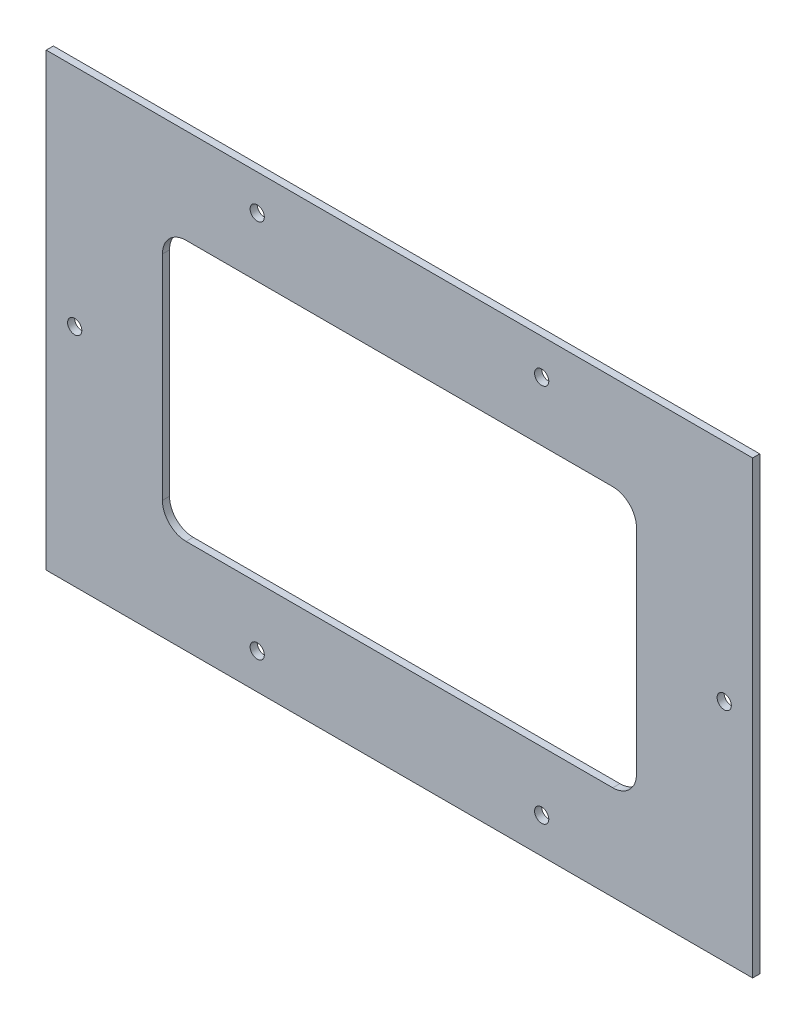
ISO-10303-21;
HEADER;
FILE_DESCRIPTION(('STEP AP214'),'2;1');
FILE_NAME('part.step','',(''),(''),'','','');
FILE_SCHEMA(('AUTOMOTIVE_DESIGN { 1 0 10303 214 1 1 1 1 }'));
ENDSEC;
DATA;
#1=APPLICATION_CONTEXT('core data for automotive mechanical design processes');
#2=APPLICATION_PROTOCOL_DEFINITION('international standard','automotive_design',2000,#1);
#3=PRODUCT_CONTEXT('',#1,'mechanical');
#4=PRODUCT('Part','Part','',(#3));
#5=PRODUCT_RELATED_PRODUCT_CATEGORY('part','',(#4));
#6=PRODUCT_DEFINITION_FORMATION('','',#4);
#7=PRODUCT_DEFINITION_CONTEXT('part definition',#1,'design');
#8=PRODUCT_DEFINITION('design','',#6,#7);
#9=PRODUCT_DEFINITION_SHAPE('','',#8);
#10=(LENGTH_UNIT() NAMED_UNIT(*) SI_UNIT(.MILLI.,.METRE.));
#11=(NAMED_UNIT(*) PLANE_ANGLE_UNIT() SI_UNIT($,.RADIAN.));
#12=(NAMED_UNIT(*) SI_UNIT($,.STERADIAN.) SOLID_ANGLE_UNIT());
#13=UNCERTAINTY_MEASURE_WITH_UNIT(LENGTH_MEASURE(1.E-05),#10,'distance_accuracy_value','');
#14=(GEOMETRIC_REPRESENTATION_CONTEXT(3) GLOBAL_UNCERTAINTY_ASSIGNED_CONTEXT((#13)) GLOBAL_UNIT_ASSIGNED_CONTEXT((#10,
#11,#12)) REPRESENTATION_CONTEXT('',''));
#15=CARTESIAN_POINT('',(0.,0.,0.));
#16=DIRECTION('',(0.,0.,1.));
#17=DIRECTION('',(1.,0.,0.));
#18=AXIS2_PLACEMENT_3D('',#15,#16,#17);
#19=CARTESIAN_POINT('',(0.,0.,1.5));
#20=DIRECTION('',(0.,0.,1.));
#21=DIRECTION('',(1.,0.,0.));
#22=AXIS2_PLACEMENT_3D('',#19,#20,#21);
#23=PLANE('',#22);
#24=DIRECTION('',(1.,0.,0.));
#25=VECTOR('',#24,1.);
#26=CARTESIAN_POINT('',(-74.5,155.,1.5));
#27=LINE('',#26,#25);
#28=CARTESIAN_POINT('',(-74.5,155.,1.5));
#29=VERTEX_POINT('',#28);
#30=CARTESIAN_POINT('',(74.5,155.,1.5));
#31=VERTEX_POINT('',#30);
#32=EDGE_CURVE('E48',#29,#31,#27,.T.);
#33=ORIENTED_EDGE('',*,*,#32,.F.);
#34=DIRECTION('',(0.,-1.,0.));
#35=VECTOR('',#34,1.);
#36=CARTESIAN_POINT('',(-74.5,165.,1.5));
#37=LINE('',#36,#35);
#38=CARTESIAN_POINT('',(-74.5,60.0000000000001,1.5));
#39=VERTEX_POINT('',#38);
#40=EDGE_CURVE('E136',#29,#39,#37,.T.);
#41=ORIENTED_EDGE('',*,*,#40,.T.);
#42=DIRECTION('',(-1.,0.,0.));
#43=VECTOR('',#42,1.);
#44=CARTESIAN_POINT('',(74.5,60.0000000000001,1.5));
#45=LINE('',#44,#43);
#46=CARTESIAN_POINT('',(74.5,60.0000000000001,1.5));
#47=VERTEX_POINT('',#46);
#48=EDGE_CURVE('E227',#47,#39,#45,.T.);
#49=ORIENTED_EDGE('',*,*,#48,.F.);
#50=DIRECTION('',(0.,1.,0.));
#51=VECTOR('',#50,1.);
#52=CARTESIAN_POINT('',(74.5,165.,1.5));
#53=LINE('',#52,#51);
#54=EDGE_CURVE('E148',#47,#31,#53,.T.);
#55=ORIENTED_EDGE('',*,*,#54,.T.);
#56=EDGE_LOOP('',(#33,#41,#49,#55));
#57=FACE_BOUND('',#56,.T.);
#58=CARTESIAN_POINT('',(68.5,107.5,1.5));
#59=DIRECTION('',(0.,0.,1.));
#60=DIRECTION('',(-1.,0.,0.));
#61=AXIS2_PLACEMENT_3D('',#58,#59,#60);
#62=CIRCLE('',#61,1.5);
#63=CARTESIAN_POINT('',(67.,107.5,1.5));
#64=VERTEX_POINT('',#63);
#65=EDGE_CURVE('E242',#64,#64,#62,.T.);
#66=ORIENTED_EDGE('',*,*,#65,.F.);
#67=EDGE_LOOP('',(#66));
#68=FACE_BOUND('',#67,.T.);
#69=CARTESIAN_POINT('',(-68.5,107.5,1.5));
#70=DIRECTION('',(0.,0.,1.));
#71=DIRECTION('',(1.,0.,0.));
#72=AXIS2_PLACEMENT_3D('',#69,#70,#71);
#73=CIRCLE('',#72,1.5);
#74=CARTESIAN_POINT('',(-67.,107.5,1.5));
#75=VERTEX_POINT('',#74);
#76=EDGE_CURVE('E241',#75,#75,#73,.T.);
#77=ORIENTED_EDGE('',*,*,#76,.F.);
#78=EDGE_LOOP('',(#77));
#79=FACE_BOUND('',#78,.T.);
#80=CARTESIAN_POINT('',(30.,147.5,1.5));
#81=DIRECTION('',(0.,0.,1.));
#82=DIRECTION('',(-1.,0.,0.));
#83=AXIS2_PLACEMENT_3D('',#80,#81,#82);
#84=CIRCLE('',#83,1.50000000000001);
#85=CARTESIAN_POINT('',(28.5,147.5,1.5));
#86=VERTEX_POINT('',#85);
#87=EDGE_CURVE('E231',#86,#86,#84,.T.);
#88=ORIENTED_EDGE('',*,*,#87,.F.);
#89=EDGE_LOOP('',(#88));
#90=FACE_BOUND('',#89,.T.);
#91=CARTESIAN_POINT('',(30.,67.5,1.5));
#92=DIRECTION('',(0.,0.,1.));
#93=DIRECTION('',(1.,0.,0.));
#94=AXIS2_PLACEMENT_3D('',#91,#92,#93);
#95=CIRCLE('',#94,1.50000000000001);
#96=CARTESIAN_POINT('',(31.5,67.5,1.5));
#97=VERTEX_POINT('',#96);
#98=EDGE_CURVE('E256',#97,#97,#95,.T.);
#99=ORIENTED_EDGE('',*,*,#98,.F.);
#100=EDGE_LOOP('',(#99));
#101=FACE_BOUND('',#100,.T.);
#102=CARTESIAN_POINT('',(-30.,67.5,1.5));
#103=DIRECTION('',(0.,0.,1.));
#104=DIRECTION('',(-1.,0.,0.));
#105=AXIS2_PLACEMENT_3D('',#102,#103,#104);
#106=CIRCLE('',#105,1.5);
#107=CARTESIAN_POINT('',(-31.5,67.5,1.5));
#108=VERTEX_POINT('',#107);
#109=EDGE_CURVE('E261',#108,#108,#106,.T.);
#110=ORIENTED_EDGE('',*,*,#109,.F.);
#111=EDGE_LOOP('',(#110));
#112=FACE_BOUND('',#111,.T.);
#113=CARTESIAN_POINT('',(-30.,147.5,1.5));
#114=DIRECTION('',(0.,0.,1.));
#115=DIRECTION('',(1.,0.,0.));
#116=AXIS2_PLACEMENT_3D('',#113,#114,#115);
#117=CIRCLE('',#116,1.5);
#118=CARTESIAN_POINT('',(-28.5,147.5,1.5));
#119=VERTEX_POINT('',#118);
#120=EDGE_CURVE('E214',#119,#119,#117,.T.);
#121=ORIENTED_EDGE('',*,*,#120,.F.);
#122=EDGE_LOOP('',(#121));
#123=FACE_BOUND('',#122,.T.);
#124=DIRECTION('',(1.,0.,0.));
#125=VECTOR('',#124,1.);
#126=CARTESIAN_POINT('',(-50.0000000000001,80.,1.5));
#127=LINE('',#126,#125);
#128=CARTESIAN_POINT('',(-45.0000000000001,80.,1.5));
#129=VERTEX_POINT('',#128);
#130=CARTESIAN_POINT('',(45.,80.,1.5));
#131=VERTEX_POINT('',#130);
#132=EDGE_CURVE('E205',#129,#131,#127,.T.);
#133=ORIENTED_EDGE('',*,*,#132,.F.);
#134=CARTESIAN_POINT('',(-45.0000000000001,85.,1.5));
#135=DIRECTION('',(0.,0.,1.));
#136=DIRECTION('',(1.,0.,0.));
#137=AXIS2_PLACEMENT_3D('',#134,#135,#136);
#138=CIRCLE('',#137,5.);
#139=CARTESIAN_POINT('',(-50.0000000000001,85.,1.5));
#140=VERTEX_POINT('',#139);
#141=EDGE_CURVE('E11',#129,#140,#138,.F.);
#142=ORIENTED_EDGE('',*,*,#141,.T.);
#143=DIRECTION('',(0.,-1.,0.));
#144=VECTOR('',#143,1.);
#145=CARTESIAN_POINT('',(-50.,135.,1.5));
#146=LINE('',#145,#144);
#147=CARTESIAN_POINT('',(-50.,130.,1.5));
#148=VERTEX_POINT('',#147);
#149=EDGE_CURVE('E203',#148,#140,#146,.T.);
#150=ORIENTED_EDGE('',*,*,#149,.F.);
#151=CARTESIAN_POINT('',(-45.,130.,1.5));
#152=DIRECTION('',(0.,0.,1.));
#153=DIRECTION('',(1.,0.,0.));
#154=AXIS2_PLACEMENT_3D('',#151,#152,#153);
#155=CIRCLE('',#154,5.);
#156=CARTESIAN_POINT('',(-45.,135.,1.5));
#157=VERTEX_POINT('',#156);
#158=EDGE_CURVE('E181',#148,#157,#155,.F.);
#159=ORIENTED_EDGE('',*,*,#158,.T.);
#160=DIRECTION('',(-1.,0.,0.));
#161=VECTOR('',#160,1.);
#162=CARTESIAN_POINT('',(-50.,135.,1.5));
#163=LINE('',#162,#161);
#164=CARTESIAN_POINT('',(45.,135.,1.5));
#165=VERTEX_POINT('',#164);
#166=EDGE_CURVE('E141',#165,#157,#163,.T.);
#167=ORIENTED_EDGE('',*,*,#166,.F.);
#168=CARTESIAN_POINT('',(45.,130.,1.5));
#169=DIRECTION('',(0.,0.,1.));
#170=DIRECTION('',(1.,0.,0.));
#171=AXIS2_PLACEMENT_3D('',#168,#169,#170);
#172=CIRCLE('',#171,5.);
#173=CARTESIAN_POINT('',(50.,130.,1.5));
#174=VERTEX_POINT('',#173);
#175=EDGE_CURVE('E177',#165,#174,#172,.F.);
#176=ORIENTED_EDGE('',*,*,#175,.T.);
#177=DIRECTION('',(0.,1.,0.));
#178=VECTOR('',#177,1.);
#179=CARTESIAN_POINT('',(50.,135.,1.5));
#180=LINE('',#179,#178);
#181=CARTESIAN_POINT('',(50.,85.,1.5));
#182=VERTEX_POINT('',#181);
#183=EDGE_CURVE('E145',#182,#174,#180,.T.);
#184=ORIENTED_EDGE('',*,*,#183,.F.);
#185=CARTESIAN_POINT('',(45.,85.,1.5));
#186=DIRECTION('',(0.,0.,1.));
#187=DIRECTION('',(1.,0.,0.));
#188=AXIS2_PLACEMENT_3D('',#185,#186,#187);
#189=CIRCLE('',#188,5.);
#190=EDGE_CURVE('E173',#182,#131,#189,.F.);
#191=ORIENTED_EDGE('',*,*,#190,.T.);
#192=EDGE_LOOP('',(#133,#142,#150,#159,#167,#176,#184,#191));
#193=FACE_BOUND('',#192,.T.);
#194=ADVANCED_FACE('F33',(#57,#68,#79,#90,#101,#112,#123,#193),#23,.T.);
#195=CARTESIAN_POINT('',(0.,0.,0.));
#196=DIRECTION('',(0.,0.,1.));
#197=DIRECTION('',(1.,0.,0.));
#198=AXIS2_PLACEMENT_3D('',#195,#196,#197);
#199=PLANE('',#198);
#200=CARTESIAN_POINT('',(68.5,107.5,0.));
#201=DIRECTION('',(0.,0.,1.));
#202=DIRECTION('',(-1.,0.,0.));
#203=AXIS2_PLACEMENT_3D('',#200,#201,#202);
#204=CIRCLE('',#203,1.5);
#205=CARTESIAN_POINT('',(67.,107.5,0.));
#206=VERTEX_POINT('',#205);
#207=EDGE_CURVE('E238',#206,#206,#204,.T.);
#208=ORIENTED_EDGE('',*,*,#207,.T.);
#209=EDGE_LOOP('',(#208));
#210=FACE_BOUND('',#209,.T.);
#211=CARTESIAN_POINT('',(-68.5,107.5,0.));
#212=DIRECTION('',(0.,0.,1.));
#213=DIRECTION('',(1.,0.,0.));
#214=AXIS2_PLACEMENT_3D('',#211,#212,#213);
#215=CIRCLE('',#214,1.5);
#216=CARTESIAN_POINT('',(-67.,107.5,0.));
#217=VERTEX_POINT('',#216);
#218=EDGE_CURVE('E247',#217,#217,#215,.T.);
#219=ORIENTED_EDGE('',*,*,#218,.T.);
#220=EDGE_LOOP('',(#219));
#221=FACE_BOUND('',#220,.T.);
#222=CARTESIAN_POINT('',(30.,147.5,0.));
#223=DIRECTION('',(0.,0.,1.));
#224=DIRECTION('',(-1.,0.,0.));
#225=AXIS2_PLACEMENT_3D('',#222,#223,#224);
#226=CIRCLE('',#225,1.50000000000001);
#227=CARTESIAN_POINT('',(28.5,147.5,0.));
#228=VERTEX_POINT('',#227);
#229=EDGE_CURVE('E234',#228,#228,#226,.T.);
#230=ORIENTED_EDGE('',*,*,#229,.T.);
#231=EDGE_LOOP('',(#230));
#232=FACE_BOUND('',#231,.T.);
#233=CARTESIAN_POINT('',(30.,67.5,0.));
#234=DIRECTION('',(0.,0.,1.));
#235=DIRECTION('',(1.,0.,0.));
#236=AXIS2_PLACEMENT_3D('',#233,#234,#235);
#237=CIRCLE('',#236,1.50000000000001);
#238=CARTESIAN_POINT('',(31.5,67.5,0.));
#239=VERTEX_POINT('',#238);
#240=EDGE_CURVE('E258',#239,#239,#237,.T.);
#241=ORIENTED_EDGE('',*,*,#240,.T.);
#242=EDGE_LOOP('',(#241));
#243=FACE_BOUND('',#242,.T.);
#244=CARTESIAN_POINT('',(-30.,67.5,0.));
#245=DIRECTION('',(0.,0.,1.));
#246=DIRECTION('',(-1.,0.,0.));
#247=AXIS2_PLACEMENT_3D('',#244,#245,#246);
#248=CIRCLE('',#247,1.5);
#249=CARTESIAN_POINT('',(-31.5,67.5,0.));
#250=VERTEX_POINT('',#249);
#251=EDGE_CURVE('E264',#250,#250,#248,.T.);
#252=ORIENTED_EDGE('',*,*,#251,.T.);
#253=EDGE_LOOP('',(#252));
#254=FACE_BOUND('',#253,.T.);
#255=CARTESIAN_POINT('',(-30.,147.5,0.));
#256=DIRECTION('',(0.,0.,1.));
#257=DIRECTION('',(1.,0.,0.));
#258=AXIS2_PLACEMENT_3D('',#255,#256,#257);
#259=CIRCLE('',#258,1.5);
#260=CARTESIAN_POINT('',(-28.5,147.5,0.));
#261=VERTEX_POINT('',#260);
#262=EDGE_CURVE('E219',#261,#261,#259,.T.);
#263=ORIENTED_EDGE('',*,*,#262,.T.);
#264=EDGE_LOOP('',(#263));
#265=FACE_BOUND('',#264,.T.);
#266=DIRECTION('',(0.,-1.,0.));
#267=VECTOR('',#266,1.);
#268=CARTESIAN_POINT('',(-74.5,165.,0.));
#269=LINE('',#268,#267);
#270=CARTESIAN_POINT('',(-74.5,155.,0.));
#271=VERTEX_POINT('',#270);
#272=CARTESIAN_POINT('',(-74.5,60.0000000000001,0.));
#273=VERTEX_POINT('',#272);
#274=EDGE_CURVE('E134',#271,#273,#269,.T.);
#275=ORIENTED_EDGE('',*,*,#274,.F.);
#276=DIRECTION('',(1.,0.,0.));
#277=VECTOR('',#276,1.);
#278=CARTESIAN_POINT('',(-74.5,155.,0.));
#279=LINE('',#278,#277);
#280=CARTESIAN_POINT('',(74.5,155.,0.));
#281=VERTEX_POINT('',#280);
#282=EDGE_CURVE('E119',#271,#281,#279,.T.);
#283=ORIENTED_EDGE('',*,*,#282,.T.);
#284=DIRECTION('',(0.,1.,0.));
#285=VECTOR('',#284,1.);
#286=CARTESIAN_POINT('',(74.5,165.,0.));
#287=LINE('',#286,#285);
#288=CARTESIAN_POINT('',(74.5,60.0000000000001,0.));
#289=VERTEX_POINT('',#288);
#290=EDGE_CURVE('E140',#289,#281,#287,.T.);
#291=ORIENTED_EDGE('',*,*,#290,.F.);
#292=DIRECTION('',(-1.,0.,0.));
#293=VECTOR('',#292,1.);
#294=CARTESIAN_POINT('',(74.5,60.0000000000001,0.));
#295=LINE('',#294,#293);
#296=EDGE_CURVE('E56',#289,#273,#295,.T.);
#297=ORIENTED_EDGE('',*,*,#296,.T.);
#298=EDGE_LOOP('',(#275,#283,#291,#297));
#299=FACE_BOUND('',#298,.T.);
#300=DIRECTION('',(-1.,0.,0.));
#301=VECTOR('',#300,1.);
#302=CARTESIAN_POINT('',(-50.,135.,0.));
#303=LINE('',#302,#301);
#304=CARTESIAN_POINT('',(45.,135.,0.));
#305=VERTEX_POINT('',#304);
#306=CARTESIAN_POINT('',(-45.,135.,0.));
#307=VERTEX_POINT('',#306);
#308=EDGE_CURVE('E209',#305,#307,#303,.T.);
#309=ORIENTED_EDGE('',*,*,#308,.T.);
#310=CARTESIAN_POINT('',(-45.,130.,0.));
#311=DIRECTION('',(0.,0.,1.));
#312=DIRECTION('',(1.,0.,0.));
#313=AXIS2_PLACEMENT_3D('',#310,#311,#312);
#314=CIRCLE('',#313,5.);
#315=CARTESIAN_POINT('',(-50.,130.,0.));
#316=VERTEX_POINT('',#315);
#317=EDGE_CURVE('E179',#307,#316,#314,.T.);
#318=ORIENTED_EDGE('',*,*,#317,.T.);
#319=DIRECTION('',(0.,-1.,0.));
#320=VECTOR('',#319,1.);
#321=CARTESIAN_POINT('',(-50.,135.,0.));
#322=LINE('',#321,#320);
#323=CARTESIAN_POINT('',(-50.0000000000001,85.,0.));
#324=VERTEX_POINT('',#323);
#325=EDGE_CURVE('E188',#316,#324,#322,.T.);
#326=ORIENTED_EDGE('',*,*,#325,.T.);
#327=CARTESIAN_POINT('',(-45.0000000000001,85.,0.));
#328=DIRECTION('',(0.,0.,1.));
#329=DIRECTION('',(1.,0.,0.));
#330=AXIS2_PLACEMENT_3D('',#327,#328,#329);
#331=CIRCLE('',#330,5.);
#332=CARTESIAN_POINT('',(-45.0000000000001,80.,0.));
#333=VERTEX_POINT('',#332);
#334=EDGE_CURVE('E41',#324,#333,#331,.T.);
#335=ORIENTED_EDGE('',*,*,#334,.T.);
#336=DIRECTION('',(1.,0.,0.));
#337=VECTOR('',#336,1.);
#338=CARTESIAN_POINT('',(-50.0000000000001,80.,0.));
#339=LINE('',#338,#337);
#340=CARTESIAN_POINT('',(45.,80.,0.));
#341=VERTEX_POINT('',#340);
#342=EDGE_CURVE('E186',#333,#341,#339,.T.);
#343=ORIENTED_EDGE('',*,*,#342,.T.);
#344=CARTESIAN_POINT('',(45.,85.,0.));
#345=DIRECTION('',(0.,0.,1.));
#346=DIRECTION('',(1.,0.,0.));
#347=AXIS2_PLACEMENT_3D('',#344,#345,#346);
#348=CIRCLE('',#347,5.);
#349=CARTESIAN_POINT('',(50.,85.,0.));
#350=VERTEX_POINT('',#349);
#351=EDGE_CURVE('E171',#341,#350,#348,.T.);
#352=ORIENTED_EDGE('',*,*,#351,.T.);
#353=DIRECTION('',(0.,1.,0.));
#354=VECTOR('',#353,1.);
#355=CARTESIAN_POINT('',(50.,135.,0.));
#356=LINE('',#355,#354);
#357=CARTESIAN_POINT('',(50.,130.,0.));
#358=VERTEX_POINT('',#357);
#359=EDGE_CURVE('E197',#350,#358,#356,.T.);
#360=ORIENTED_EDGE('',*,*,#359,.T.);
#361=CARTESIAN_POINT('',(45.,130.,0.));
#362=DIRECTION('',(0.,0.,1.));
#363=DIRECTION('',(1.,0.,0.));
#364=AXIS2_PLACEMENT_3D('',#361,#362,#363);
#365=CIRCLE('',#364,5.);
#366=EDGE_CURVE('E175',#358,#305,#365,.T.);
#367=ORIENTED_EDGE('',*,*,#366,.T.);
#368=EDGE_LOOP('',(#309,#318,#326,#335,#343,#352,#360,#367));
#369=FACE_BOUND('',#368,.T.);
#370=ADVANCED_FACE('F138',(#210,#221,#232,#243,#254,#265,#299,#369),#199,.F.);
#371=CARTESIAN_POINT('',(-74.5,165.,1.5));
#372=DIRECTION('',(1.,0.,0.));
#373=DIRECTION('',(0.,1.,0.));
#374=AXIS2_PLACEMENT_3D('',#371,#372,#373);
#375=PLANE('',#374);
#376=ORIENTED_EDGE('',*,*,#40,.F.);
#377=DIRECTION('',(0.,0.,1.));
#378=VECTOR('',#377,1.);
#379=CARTESIAN_POINT('',(-74.5,155.,0.));
#380=LINE('',#379,#378);
#381=EDGE_CURVE('E122',#271,#29,#380,.T.);
#382=ORIENTED_EDGE('',*,*,#381,.F.);
#383=ORIENTED_EDGE('',*,*,#274,.T.);
#384=DIRECTION('',(0.,0.,1.));
#385=VECTOR('',#384,1.);
#386=CARTESIAN_POINT('',(-74.5,60.0000000000001,0.));
#387=LINE('',#386,#385);
#388=EDGE_CURVE('E248',#273,#39,#387,.T.);
#389=ORIENTED_EDGE('',*,*,#388,.T.);
#390=EDGE_LOOP('',(#376,#382,#383,#389));
#391=FACE_BOUND('',#390,.T.);
#392=ADVANCED_FACE('F132',(#391),#375,.F.);
#393=CARTESIAN_POINT('',(74.5,165.,1.5));
#394=DIRECTION('',(-1.,0.,0.));
#395=DIRECTION('',(0.,-1.,0.));
#396=AXIS2_PLACEMENT_3D('',#393,#394,#395);
#397=PLANE('',#396);
#398=ORIENTED_EDGE('',*,*,#290,.T.);
#399=DIRECTION('',(0.,0.,1.));
#400=VECTOR('',#399,1.);
#401=CARTESIAN_POINT('',(74.5,155.,0.));
#402=LINE('',#401,#400);
#403=EDGE_CURVE('E123',#281,#31,#402,.T.);
#404=ORIENTED_EDGE('',*,*,#403,.T.);
#405=ORIENTED_EDGE('',*,*,#54,.F.);
#406=DIRECTION('',(0.,0.,1.));
#407=VECTOR('',#406,1.);
#408=CARTESIAN_POINT('',(74.5,60.0000000000001,0.));
#409=LINE('',#408,#407);
#410=EDGE_CURVE('E230',#289,#47,#409,.T.);
#411=ORIENTED_EDGE('',*,*,#410,.F.);
#412=EDGE_LOOP('',(#398,#404,#405,#411));
#413=FACE_BOUND('',#412,.T.);
#414=ADVANCED_FACE('F229',(#413),#397,.F.);
#415=CARTESIAN_POINT('',(-50.,135.,1.5));
#416=DIRECTION('',(1.,0.,0.));
#417=DIRECTION('',(0.,1.,0.));
#418=AXIS2_PLACEMENT_3D('',#415,#416,#417);
#419=PLANE('',#418);
#420=ORIENTED_EDGE('',*,*,#325,.F.);
#421=DIRECTION('',(0.,0.,-1.));
#422=VECTOR('',#421,1.);
#423=CARTESIAN_POINT('',(-50.,130.,1.5));
#424=LINE('',#423,#422);
#425=EDGE_CURVE('E169',#316,#148,#424,.F.);
#426=ORIENTED_EDGE('',*,*,#425,.T.);
#427=ORIENTED_EDGE('',*,*,#149,.T.);
#428=DIRECTION('',(0.,0.,-1.));
#429=VECTOR('',#428,1.);
#430=CARTESIAN_POINT('',(-50.0000000000001,85.,0.));
#431=LINE('',#430,#429);
#432=EDGE_CURVE('E166',#140,#324,#431,.T.);
#433=ORIENTED_EDGE('',*,*,#432,.T.);
#434=EDGE_LOOP('',(#420,#426,#427,#433));
#435=FACE_BOUND('',#434,.T.);
#436=ADVANCED_FACE('F207',(#435),#419,.T.);
#437=CARTESIAN_POINT('',(-50.0000000000001,80.,1.5));
#438=DIRECTION('',(0.,1.,0.));
#439=DIRECTION('',(-1.,0.,0.));
#440=AXIS2_PLACEMENT_3D('',#437,#438,#439);
#441=PLANE('',#440);
#442=ORIENTED_EDGE('',*,*,#132,.T.);
#443=DIRECTION('',(0.,0.,-1.));
#444=VECTOR('',#443,1.);
#445=CARTESIAN_POINT('',(45.,80.,0.));
#446=LINE('',#445,#444);
#447=EDGE_CURVE('E153',#131,#341,#446,.T.);
#448=ORIENTED_EDGE('',*,*,#447,.T.);
#449=ORIENTED_EDGE('',*,*,#342,.F.);
#450=DIRECTION('',(0.,0.,-1.));
#451=VECTOR('',#450,1.);
#452=CARTESIAN_POINT('',(-45.0000000000001,80.,1.5));
#453=LINE('',#452,#451);
#454=EDGE_CURVE('E151',#333,#129,#453,.F.);
#455=ORIENTED_EDGE('',*,*,#454,.T.);
#456=EDGE_LOOP('',(#442,#448,#449,#455));
#457=FACE_BOUND('',#456,.T.);
#458=ADVANCED_FACE('F194',(#457),#441,.T.);
#459=CARTESIAN_POINT('',(50.,135.,1.5));
#460=DIRECTION('',(-1.,0.,0.));
#461=DIRECTION('',(0.,-1.,0.));
#462=AXIS2_PLACEMENT_3D('',#459,#460,#461);
#463=PLANE('',#462);
#464=ORIENTED_EDGE('',*,*,#359,.F.);
#465=DIRECTION('',(0.,0.,-1.));
#466=VECTOR('',#465,1.);
#467=CARTESIAN_POINT('',(50.,85.,1.5));
#468=LINE('',#467,#466);
#469=EDGE_CURVE('E159',#350,#182,#468,.F.);
#470=ORIENTED_EDGE('',*,*,#469,.T.);
#471=ORIENTED_EDGE('',*,*,#183,.T.);
#472=DIRECTION('',(0.,0.,-1.));
#473=VECTOR('',#472,1.);
#474=CARTESIAN_POINT('',(50.,130.,0.));
#475=LINE('',#474,#473);
#476=EDGE_CURVE('E156',#174,#358,#475,.T.);
#477=ORIENTED_EDGE('',*,*,#476,.T.);
#478=EDGE_LOOP('',(#464,#470,#471,#477));
#479=FACE_BOUND('',#478,.T.);
#480=ADVANCED_FACE('F315',(#479),#463,.T.);
#481=CARTESIAN_POINT('',(-50.,135.,1.5));
#482=DIRECTION('',(0.,-1.,0.));
#483=DIRECTION('',(1.,0.,0.));
#484=AXIS2_PLACEMENT_3D('',#481,#482,#483);
#485=PLANE('',#484);
#486=ORIENTED_EDGE('',*,*,#308,.F.);
#487=DIRECTION('',(0.,0.,-1.));
#488=VECTOR('',#487,1.);
#489=CARTESIAN_POINT('',(45.,135.,1.5));
#490=LINE('',#489,#488);
#491=EDGE_CURVE('E164',#305,#165,#490,.F.);
#492=ORIENTED_EDGE('',*,*,#491,.T.);
#493=ORIENTED_EDGE('',*,*,#166,.T.);
#494=DIRECTION('',(0.,0.,-1.));
#495=VECTOR('',#494,1.);
#496=CARTESIAN_POINT('',(-45.,135.,0.));
#497=LINE('',#496,#495);
#498=EDGE_CURVE('E161',#157,#307,#497,.T.);
#499=ORIENTED_EDGE('',*,*,#498,.T.);
#500=EDGE_LOOP('',(#486,#492,#493,#499));
#501=FACE_BOUND('',#500,.T.);
#502=ADVANCED_FACE('F294',(#501),#485,.T.);
#503=CARTESIAN_POINT('',(45.,85.,1.5));
#504=DIRECTION('',(0.,0.,1.));
#505=DIRECTION('',(1.,0.,0.));
#506=AXIS2_PLACEMENT_3D('',#503,#504,#505);
#507=CYLINDRICAL_SURFACE('',#506,5.);
#508=ORIENTED_EDGE('',*,*,#190,.F.);
#509=ORIENTED_EDGE('',*,*,#469,.F.);
#510=ORIENTED_EDGE('',*,*,#351,.F.);
#511=ORIENTED_EDGE('',*,*,#447,.F.);
#512=EDGE_LOOP('',(#508,#509,#510,#511));
#513=FACE_BOUND('',#512,.T.);
#514=ADVANCED_FACE('F290',(#513),#507,.F.);
#515=CARTESIAN_POINT('',(45.,130.,1.5));
#516=DIRECTION('',(0.,0.,1.));
#517=DIRECTION('',(1.,0.,0.));
#518=AXIS2_PLACEMENT_3D('',#515,#516,#517);
#519=CYLINDRICAL_SURFACE('',#518,5.);
#520=ORIENTED_EDGE('',*,*,#175,.F.);
#521=ORIENTED_EDGE('',*,*,#491,.F.);
#522=ORIENTED_EDGE('',*,*,#366,.F.);
#523=ORIENTED_EDGE('',*,*,#476,.F.);
#524=EDGE_LOOP('',(#520,#521,#522,#523));
#525=FACE_BOUND('',#524,.T.);
#526=ADVANCED_FACE('F293',(#525),#519,.F.);
#527=CARTESIAN_POINT('',(-45.,130.,1.5));
#528=DIRECTION('',(0.,0.,1.));
#529=DIRECTION('',(1.,0.,0.));
#530=AXIS2_PLACEMENT_3D('',#527,#528,#529);
#531=CYLINDRICAL_SURFACE('',#530,5.);
#532=ORIENTED_EDGE('',*,*,#158,.F.);
#533=ORIENTED_EDGE('',*,*,#425,.F.);
#534=ORIENTED_EDGE('',*,*,#317,.F.);
#535=ORIENTED_EDGE('',*,*,#498,.F.);
#536=EDGE_LOOP('',(#532,#533,#534,#535));
#537=FACE_BOUND('',#536,.T.);
#538=ADVANCED_FACE('F297',(#537),#531,.F.);
#539=CARTESIAN_POINT('',(-45.0000000000001,85.,1.5));
#540=DIRECTION('',(0.,0.,1.));
#541=DIRECTION('',(1.,0.,0.));
#542=AXIS2_PLACEMENT_3D('',#539,#540,#541);
#543=CYLINDRICAL_SURFACE('',#542,5.);
#544=ORIENTED_EDGE('',*,*,#141,.F.);
#545=ORIENTED_EDGE('',*,*,#454,.F.);
#546=ORIENTED_EDGE('',*,*,#334,.F.);
#547=ORIENTED_EDGE('',*,*,#432,.F.);
#548=EDGE_LOOP('',(#544,#545,#546,#547));
#549=FACE_BOUND('',#548,.T.);
#550=ADVANCED_FACE('F35',(#549),#543,.F.);
#551=CARTESIAN_POINT('',(-30.,147.5,0.));
#552=DIRECTION('',(0.,0.,1.));
#553=DIRECTION('',(1.,0.,0.));
#554=AXIS2_PLACEMENT_3D('',#551,#552,#553);
#555=CYLINDRICAL_SURFACE('',#554,1.5);
#556=ORIENTED_EDGE('',*,*,#262,.F.);
#557=EDGE_LOOP('',(#556));
#558=FACE_BOUND('',#557,.T.);
#559=ORIENTED_EDGE('',*,*,#120,.T.);
#560=EDGE_LOOP('',(#559));
#561=FACE_BOUND('',#560,.T.);
#562=ADVANCED_FACE('F274',(#558,#561),#555,.F.);
#563=CARTESIAN_POINT('',(-30.,67.5,0.));
#564=DIRECTION('',(0.,0.,1.));
#565=DIRECTION('',(1.,0.,0.));
#566=AXIS2_PLACEMENT_3D('',#563,#564,#565);
#567=CYLINDRICAL_SURFACE('',#566,1.5);
#568=ORIENTED_EDGE('',*,*,#251,.F.);
#569=EDGE_LOOP('',(#568));
#570=FACE_BOUND('',#569,.T.);
#571=ORIENTED_EDGE('',*,*,#109,.T.);
#572=EDGE_LOOP('',(#571));
#573=FACE_BOUND('',#572,.T.);
#574=ADVANCED_FACE('F327',(#570,#573),#567,.F.);
#575=CARTESIAN_POINT('',(30.,67.5,0.));
#576=DIRECTION('',(0.,0.,1.));
#577=DIRECTION('',(1.,0.,0.));
#578=AXIS2_PLACEMENT_3D('',#575,#576,#577);
#579=CYLINDRICAL_SURFACE('',#578,1.50000000000001);
#580=ORIENTED_EDGE('',*,*,#240,.F.);
#581=EDGE_LOOP('',(#580));
#582=FACE_BOUND('',#581,.T.);
#583=ORIENTED_EDGE('',*,*,#98,.T.);
#584=EDGE_LOOP('',(#583));
#585=FACE_BOUND('',#584,.T.);
#586=ADVANCED_FACE('F331',(#582,#585),#579,.F.);
#587=CARTESIAN_POINT('',(30.,147.5,0.));
#588=DIRECTION('',(0.,0.,1.));
#589=DIRECTION('',(1.,0.,0.));
#590=AXIS2_PLACEMENT_3D('',#587,#588,#589);
#591=CYLINDRICAL_SURFACE('',#590,1.50000000000001);
#592=ORIENTED_EDGE('',*,*,#229,.F.);
#593=EDGE_LOOP('',(#592));
#594=FACE_BOUND('',#593,.T.);
#595=ORIENTED_EDGE('',*,*,#87,.T.);
#596=EDGE_LOOP('',(#595));
#597=FACE_BOUND('',#596,.T.);
#598=ADVANCED_FACE('F335',(#594,#597),#591,.F.);
#599=CARTESIAN_POINT('',(74.5,60.0000000000001,0.));
#600=DIRECTION('',(0.,1.,0.));
#601=DIRECTION('',(0.,0.,1.));
#602=AXIS2_PLACEMENT_3D('',#599,#600,#601);
#603=PLANE('',#602);
#604=ORIENTED_EDGE('',*,*,#48,.T.);
#605=ORIENTED_EDGE('',*,*,#388,.F.);
#606=ORIENTED_EDGE('',*,*,#296,.F.);
#607=ORIENTED_EDGE('',*,*,#410,.T.);
#608=EDGE_LOOP('',(#604,#605,#606,#607));
#609=FACE_BOUND('',#608,.T.);
#610=ADVANCED_FACE('F339',(#609),#603,.F.);
#611=CARTESIAN_POINT('',(-74.5,155.,0.));
#612=DIRECTION('',(0.,-1.,0.));
#613=DIRECTION('',(0.,0.,-1.));
#614=AXIS2_PLACEMENT_3D('',#611,#612,#613);
#615=PLANE('',#614);
#616=ORIENTED_EDGE('',*,*,#32,.T.);
#617=ORIENTED_EDGE('',*,*,#403,.F.);
#618=ORIENTED_EDGE('',*,*,#282,.F.);
#619=ORIENTED_EDGE('',*,*,#381,.T.);
#620=EDGE_LOOP('',(#616,#617,#618,#619));
#621=FACE_BOUND('',#620,.T.);
#622=ADVANCED_FACE('F121',(#621),#615,.F.);
#623=CARTESIAN_POINT('',(-68.5,107.5,0.));
#624=DIRECTION('',(0.,0.,1.));
#625=DIRECTION('',(1.,0.,0.));
#626=AXIS2_PLACEMENT_3D('',#623,#624,#625);
#627=CYLINDRICAL_SURFACE('',#626,1.5);
#628=ORIENTED_EDGE('',*,*,#218,.F.);
#629=EDGE_LOOP('',(#628));
#630=FACE_BOUND('',#629,.T.);
#631=ORIENTED_EDGE('',*,*,#76,.T.);
#632=EDGE_LOOP('',(#631));
#633=FACE_BOUND('',#632,.T.);
#634=ADVANCED_FACE('F341',(#630,#633),#627,.F.);
#635=CARTESIAN_POINT('',(68.5,107.5,0.));
#636=DIRECTION('',(0.,0.,1.));
#637=DIRECTION('',(1.,0.,0.));
#638=AXIS2_PLACEMENT_3D('',#635,#636,#637);
#639=CYLINDRICAL_SURFACE('',#638,1.5);
#640=ORIENTED_EDGE('',*,*,#207,.F.);
#641=EDGE_LOOP('',(#640));
#642=FACE_BOUND('',#641,.T.);
#643=ORIENTED_EDGE('',*,*,#65,.T.);
#644=EDGE_LOOP('',(#643));
#645=FACE_BOUND('',#644,.T.);
#646=ADVANCED_FACE('F344',(#642,#645),#639,.F.);
#647=CLOSED_SHELL('',(#194,#370,#392,#414,#436,#458,#480,#502,#514,#526,#538,#550,#562,#574,
#586,#598,#610,#622,#634,#646));
#648=MANIFOLD_SOLID_BREP('B2',#647);
#649=ADVANCED_BREP_SHAPE_REPRESENTATION('',(#18,#648),#14);
#650=SHAPE_DEFINITION_REPRESENTATION(#9,#649);
ENDSEC;
END-ISO-10303-21;
